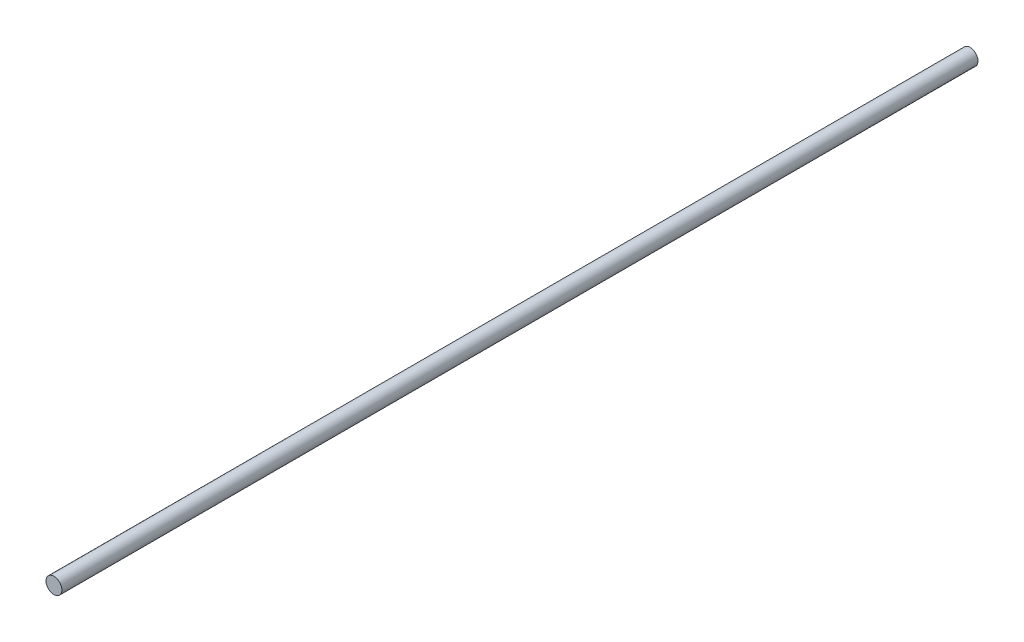
ISO-10303-21;
HEADER;
FILE_DESCRIPTION(('STEP AP214'),'2;1');
FILE_NAME('part.step','',(''),(''),'','','');
FILE_SCHEMA(('AUTOMOTIVE_DESIGN { 1 0 10303 214 1 1 1 1 }'));
ENDSEC;
DATA;
#1=APPLICATION_CONTEXT('core data for automotive mechanical design processes');
#2=APPLICATION_PROTOCOL_DEFINITION('international standard','automotive_design',2000,#1);
#3=PRODUCT_CONTEXT('',#1,'mechanical');
#4=PRODUCT('Part','Part','',(#3));
#5=PRODUCT_RELATED_PRODUCT_CATEGORY('part','',(#4));
#6=PRODUCT_DEFINITION_FORMATION('','',#4);
#7=PRODUCT_DEFINITION_CONTEXT('part definition',#1,'design');
#8=PRODUCT_DEFINITION('design','',#6,#7);
#9=PRODUCT_DEFINITION_SHAPE('','',#8);
#10=(LENGTH_UNIT() NAMED_UNIT(*) SI_UNIT(.MILLI.,.METRE.));
#11=(NAMED_UNIT(*) PLANE_ANGLE_UNIT() SI_UNIT($,.RADIAN.));
#12=(NAMED_UNIT(*) SI_UNIT($,.STERADIAN.) SOLID_ANGLE_UNIT());
#13=UNCERTAINTY_MEASURE_WITH_UNIT(LENGTH_MEASURE(1.E-05),#10,'distance_accuracy_value','');
#14=(GEOMETRIC_REPRESENTATION_CONTEXT(3) GLOBAL_UNCERTAINTY_ASSIGNED_CONTEXT((#13)) GLOBAL_UNIT_ASSIGNED_CONTEXT((#10,
#11,#12)) REPRESENTATION_CONTEXT('',''));
#15=CARTESIAN_POINT('',(0.,0.,0.));
#16=DIRECTION('',(0.,0.,1.));
#17=DIRECTION('',(1.,0.,0.));
#18=AXIS2_PLACEMENT_3D('',#15,#16,#17);
#19=CARTESIAN_POINT('',(0.,0.,693.));
#20=DIRECTION('',(0.,0.,-1.));
#21=DIRECTION('',(-1.,0.,0.));
#22=AXIS2_PLACEMENT_3D('',#19,#20,#21);
#23=CYLINDRICAL_SURFACE('',#22,6.);
#24=CARTESIAN_POINT('',(0.,0.,693.));
#25=DIRECTION('',(0.,0.,1.));
#26=DIRECTION('',(1.,0.,0.));
#27=AXIS2_PLACEMENT_3D('',#24,#25,#26);
#28=CIRCLE('',#27,6.);
#29=CARTESIAN_POINT('',(6.,0.,693.));
#30=VERTEX_POINT('',#29);
#31=EDGE_CURVE('E10',#30,#30,#28,.T.);
#32=ORIENTED_EDGE('',*,*,#31,.F.);
#33=EDGE_LOOP('',(#32));
#34=FACE_BOUND('',#33,.T.);
#35=CARTESIAN_POINT('',(0.,0.,0.));
#36=DIRECTION('',(0.,0.,1.));
#37=DIRECTION('',(1.,0.,0.));
#38=AXIS2_PLACEMENT_3D('',#35,#36,#37);
#39=CIRCLE('',#38,6.);
#40=CARTESIAN_POINT('',(6.,0.,0.));
#41=VERTEX_POINT('',#40);
#42=EDGE_CURVE('E35',#41,#41,#39,.T.);
#43=ORIENTED_EDGE('',*,*,#42,.T.);
#44=EDGE_LOOP('',(#43));
#45=FACE_BOUND('',#44,.T.);
#46=ADVANCED_FACE('F32',(#34,#45),#23,.T.);
#47=CARTESIAN_POINT('',(0.,0.,693.));
#48=DIRECTION('',(0.,0.,1.));
#49=DIRECTION('',(1.,0.,0.));
#50=AXIS2_PLACEMENT_3D('',#47,#48,#49);
#51=PLANE('',#50);
#52=ORIENTED_EDGE('',*,*,#31,.T.);
#53=EDGE_LOOP('',(#52));
#54=FACE_BOUND('',#53,.T.);
#55=ADVANCED_FACE('F47',(#54),#51,.T.);
#56=CARTESIAN_POINT('',(0.,0.,0.));
#57=DIRECTION('',(0.,0.,1.));
#58=DIRECTION('',(1.,0.,0.));
#59=AXIS2_PLACEMENT_3D('',#56,#57,#58);
#60=PLANE('',#59);
#61=ORIENTED_EDGE('',*,*,#42,.F.);
#62=EDGE_LOOP('',(#61));
#63=FACE_BOUND('',#62,.T.);
#64=ADVANCED_FACE('F45',(#63),#60,.F.);
#65=CLOSED_SHELL('',(#46,#55,#64));
#66=MANIFOLD_SOLID_BREP('B2',#65);
#67=ADVANCED_BREP_SHAPE_REPRESENTATION('',(#18,#66),#14);
#68=SHAPE_DEFINITION_REPRESENTATION(#9,#67);
ENDSEC;
END-ISO-10303-21;
